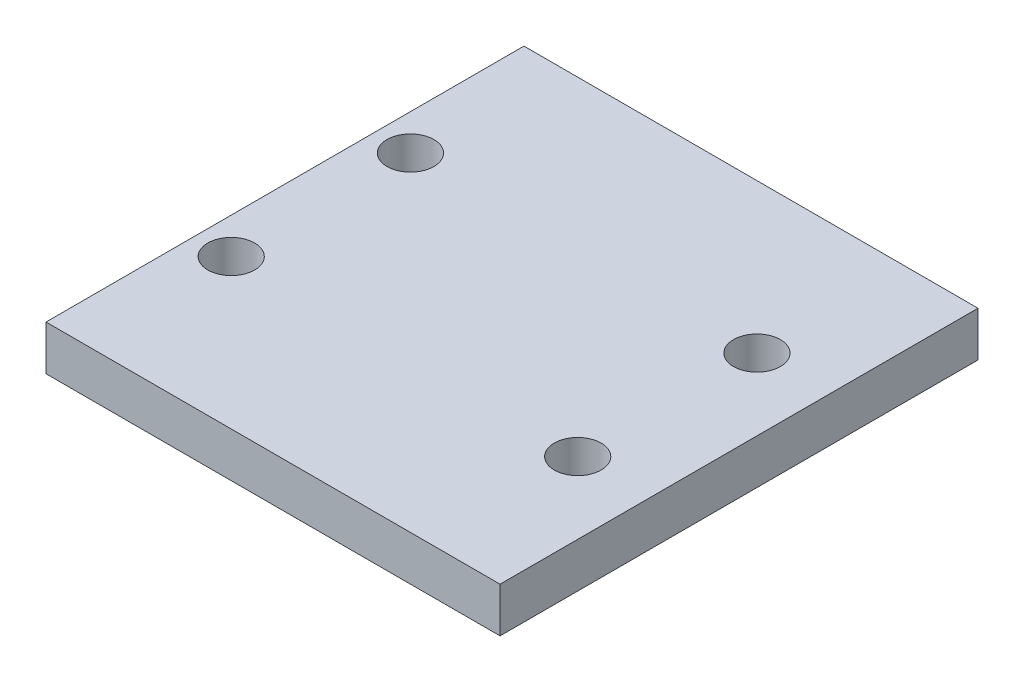
ISO-10303-21;
HEADER;
FILE_DESCRIPTION(('STEP AP214'),'2;1');
FILE_NAME('part.step','',(''),(''),'','','');
FILE_SCHEMA(('AUTOMOTIVE_DESIGN { 1 0 10303 214 1 1 1 1 }'));
ENDSEC;
DATA;
#1=APPLICATION_CONTEXT('core data for automotive mechanical design processes');
#2=APPLICATION_PROTOCOL_DEFINITION('international standard','automotive_design',2000,#1);
#3=PRODUCT_CONTEXT('',#1,'mechanical');
#4=PRODUCT('Part','Part','',(#3));
#5=PRODUCT_RELATED_PRODUCT_CATEGORY('part','',(#4));
#6=PRODUCT_DEFINITION_FORMATION('','',#4);
#7=PRODUCT_DEFINITION_CONTEXT('part definition',#1,'design');
#8=PRODUCT_DEFINITION('design','',#6,#7);
#9=PRODUCT_DEFINITION_SHAPE('','',#8);
#10=(LENGTH_UNIT() NAMED_UNIT(*) SI_UNIT(.MILLI.,.METRE.));
#11=(NAMED_UNIT(*) PLANE_ANGLE_UNIT() SI_UNIT($,.RADIAN.));
#12=(NAMED_UNIT(*) SI_UNIT($,.STERADIAN.) SOLID_ANGLE_UNIT());
#13=UNCERTAINTY_MEASURE_WITH_UNIT(LENGTH_MEASURE(1.E-05),#10,'distance_accuracy_value','');
#14=(GEOMETRIC_REPRESENTATION_CONTEXT(3) GLOBAL_UNCERTAINTY_ASSIGNED_CONTEXT((#13)) GLOBAL_UNIT_ASSIGNED_CONTEXT((#10,
#11,#12)) REPRESENTATION_CONTEXT('',''));
#15=CARTESIAN_POINT('',(0.,0.,0.));
#16=DIRECTION('',(0.,0.,1.));
#17=DIRECTION('',(1.,0.,0.));
#18=AXIS2_PLACEMENT_3D('',#15,#16,#17);
#19=CARTESIAN_POINT('',(0.,4.7625,0.));
#20=DIRECTION('',(1.,0.,0.));
#21=DIRECTION('',(0.,0.,-1.));
#22=AXIS2_PLACEMENT_3D('',#19,#20,#21);
#23=PLANE('',#22);
#24=DIRECTION('',(0.,0.,1.));
#25=VECTOR('',#24,1.);
#26=CARTESIAN_POINT('',(0.,0.,0.));
#27=LINE('',#26,#25);
#28=CARTESIAN_POINT('',(0.,0.,-50.8));
#29=VERTEX_POINT('',#28);
#30=CARTESIAN_POINT('',(0.,0.,0.));
#31=VERTEX_POINT('',#30);
#32=EDGE_CURVE('E107',#29,#31,#27,.T.);
#33=ORIENTED_EDGE('',*,*,#32,.T.);
#34=DIRECTION('',(0.,-1.,0.));
#35=VECTOR('',#34,1.);
#36=CARTESIAN_POINT('',(0.,4.7625,0.));
#37=LINE('',#36,#35);
#38=CARTESIAN_POINT('',(0.,4.7625,0.));
#39=VERTEX_POINT('',#38);
#40=EDGE_CURVE('E11',#39,#31,#37,.T.);
#41=ORIENTED_EDGE('',*,*,#40,.F.);
#42=DIRECTION('',(0.,0.,1.));
#43=VECTOR('',#42,1.);
#44=CARTESIAN_POINT('',(0.,4.7625,0.));
#45=LINE('',#44,#43);
#46=CARTESIAN_POINT('',(0.,4.7625,-50.8));
#47=VERTEX_POINT('',#46);
#48=EDGE_CURVE('E91',#47,#39,#45,.T.);
#49=ORIENTED_EDGE('',*,*,#48,.F.);
#50=DIRECTION('',(0.,-1.,0.));
#51=VECTOR('',#50,1.);
#52=CARTESIAN_POINT('',(0.,4.7625,-50.8));
#53=LINE('',#52,#51);
#54=EDGE_CURVE('E103',#47,#29,#53,.T.);
#55=ORIENTED_EDGE('',*,*,#54,.T.);
#56=EDGE_LOOP('',(#33,#41,#49,#55));
#57=FACE_BOUND('',#56,.T.);
#58=ADVANCED_FACE('F39',(#57),#23,.F.);
#59=CARTESIAN_POINT('',(0.,4.7625,0.));
#60=DIRECTION('',(0.,0.,-1.));
#61=DIRECTION('',(-1.,0.,0.));
#62=AXIS2_PLACEMENT_3D('',#59,#60,#61);
#63=PLANE('',#62);
#64=DIRECTION('',(1.,0.,0.));
#65=VECTOR('',#64,1.);
#66=CARTESIAN_POINT('',(0.,0.,0.));
#67=LINE('',#66,#65);
#68=CARTESIAN_POINT('',(48.26,0.,0.));
#69=VERTEX_POINT('',#68);
#70=EDGE_CURVE('E96',#31,#69,#67,.T.);
#71=ORIENTED_EDGE('',*,*,#70,.T.);
#72=DIRECTION('',(0.,-1.,0.));
#73=VECTOR('',#72,1.);
#74=CARTESIAN_POINT('',(48.26,4.7625,0.));
#75=LINE('',#74,#73);
#76=CARTESIAN_POINT('',(48.26,4.7625,0.));
#77=VERTEX_POINT('',#76);
#78=EDGE_CURVE('E48',#77,#69,#75,.T.);
#79=ORIENTED_EDGE('',*,*,#78,.F.);
#80=DIRECTION('',(1.,0.,0.));
#81=VECTOR('',#80,1.);
#82=CARTESIAN_POINT('',(0.,4.7625,0.));
#83=LINE('',#82,#81);
#84=EDGE_CURVE('E86',#39,#77,#83,.T.);
#85=ORIENTED_EDGE('',*,*,#84,.F.);
#86=ORIENTED_EDGE('',*,*,#40,.T.);
#87=EDGE_LOOP('',(#71,#79,#85,#86));
#88=FACE_BOUND('',#87,.T.);
#89=ADVANCED_FACE('F95',(#88),#63,.F.);
#90=CARTESIAN_POINT('',(48.26,4.7625,0.));
#91=DIRECTION('',(-1.,0.,0.));
#92=DIRECTION('',(0.,0.,1.));
#93=AXIS2_PLACEMENT_3D('',#90,#91,#92);
#94=PLANE('',#93);
#95=DIRECTION('',(0.,0.,-1.));
#96=VECTOR('',#95,1.);
#97=CARTESIAN_POINT('',(48.26,0.,0.));
#98=LINE('',#97,#96);
#99=CARTESIAN_POINT('',(48.26,0.,-50.8));
#100=VERTEX_POINT('',#99);
#101=EDGE_CURVE('E73',#69,#100,#98,.T.);
#102=ORIENTED_EDGE('',*,*,#101,.T.);
#103=DIRECTION('',(0.,-1.,0.));
#104=VECTOR('',#103,1.);
#105=CARTESIAN_POINT('',(48.26,4.7625,-50.8));
#106=LINE('',#105,#104);
#107=CARTESIAN_POINT('',(48.26,4.7625,-50.8));
#108=VERTEX_POINT('',#107);
#109=EDGE_CURVE('E98',#108,#100,#106,.T.);
#110=ORIENTED_EDGE('',*,*,#109,.F.);
#111=DIRECTION('',(0.,0.,-1.));
#112=VECTOR('',#111,1.);
#113=CARTESIAN_POINT('',(48.26,4.7625,0.));
#114=LINE('',#113,#112);
#115=EDGE_CURVE('E89',#77,#108,#114,.T.);
#116=ORIENTED_EDGE('',*,*,#115,.F.);
#117=ORIENTED_EDGE('',*,*,#78,.T.);
#118=EDGE_LOOP('',(#102,#110,#116,#117));
#119=FACE_BOUND('',#118,.T.);
#120=ADVANCED_FACE('F99',(#119),#94,.F.);
#121=CARTESIAN_POINT('',(0.,4.7625,-50.8));
#122=DIRECTION('',(0.,0.,1.));
#123=DIRECTION('',(1.,0.,0.));
#124=AXIS2_PLACEMENT_3D('',#121,#122,#123);
#125=PLANE('',#124);
#126=DIRECTION('',(-1.,0.,0.));
#127=VECTOR('',#126,1.);
#128=CARTESIAN_POINT('',(0.,0.,-50.8));
#129=LINE('',#128,#127);
#130=EDGE_CURVE('E79',#100,#29,#129,.T.);
#131=ORIENTED_EDGE('',*,*,#130,.T.);
#132=ORIENTED_EDGE('',*,*,#54,.F.);
#133=DIRECTION('',(-1.,0.,0.));
#134=VECTOR('',#133,1.);
#135=CARTESIAN_POINT('',(0.,4.7625,-50.8));
#136=LINE('',#135,#134);
#137=EDGE_CURVE('E56',#108,#47,#136,.T.);
#138=ORIENTED_EDGE('',*,*,#137,.F.);
#139=ORIENTED_EDGE('',*,*,#109,.T.);
#140=EDGE_LOOP('',(#131,#132,#138,#139));
#141=FACE_BOUND('',#140,.T.);
#142=ADVANCED_FACE('F121',(#141),#125,.F.);
#143=CARTESIAN_POINT('',(0.,4.7625,0.));
#144=DIRECTION('',(0.,-1.,0.));
#145=DIRECTION('',(0.,0.,-1.));
#146=AXIS2_PLACEMENT_3D('',#143,#144,#145);
#147=PLANE('',#146);
#148=CARTESIAN_POINT('',(3.81,4.7625,-34.925));
#149=DIRECTION('',(0.,1.,0.));
#150=DIRECTION('',(0.,0.,-1.));
#151=AXIS2_PLACEMENT_3D('',#148,#149,#150);
#152=CIRCLE('',#151,2.4892);
#153=CARTESIAN_POINT('',(3.81,4.7625,-32.4358));
#154=VERTEX_POINT('',#153);
#155=EDGE_CURVE('E136',#154,#154,#152,.T.);
#156=ORIENTED_EDGE('',*,*,#155,.F.);
#157=EDGE_LOOP('',(#156));
#158=FACE_BOUND('',#157,.T.);
#159=CARTESIAN_POINT('',(40.64,4.7625,-34.925));
#160=DIRECTION('',(0.,1.,0.));
#161=DIRECTION('',(0.,0.,1.));
#162=AXIS2_PLACEMENT_3D('',#159,#160,#161);
#163=CIRCLE('',#162,2.4892);
#164=CARTESIAN_POINT('',(40.64,4.7625,-32.4358));
#165=VERTEX_POINT('',#164);
#166=EDGE_CURVE('E144',#165,#165,#163,.T.);
#167=ORIENTED_EDGE('',*,*,#166,.F.);
#168=EDGE_LOOP('',(#167));
#169=FACE_BOUND('',#168,.T.);
#170=CARTESIAN_POINT('',(40.64,4.7625,-15.875));
#171=DIRECTION('',(0.,1.,0.));
#172=DIRECTION('',(0.,0.,-1.));
#173=AXIS2_PLACEMENT_3D('',#170,#171,#172);
#174=CIRCLE('',#173,2.4892);
#175=CARTESIAN_POINT('',(40.64,4.7625,-13.3858));
#176=VERTEX_POINT('',#175);
#177=EDGE_CURVE('E152',#176,#176,#174,.T.);
#178=ORIENTED_EDGE('',*,*,#177,.F.);
#179=EDGE_LOOP('',(#178));
#180=FACE_BOUND('',#179,.T.);
#181=CARTESIAN_POINT('',(3.81,4.7625,-15.875));
#182=DIRECTION('',(0.,1.,0.));
#183=DIRECTION('',(0.,0.,1.));
#184=AXIS2_PLACEMENT_3D('',#181,#182,#183);
#185=CIRCLE('',#184,2.4892);
#186=CARTESIAN_POINT('',(3.81,4.7625,-13.3858));
#187=VERTEX_POINT('',#186);
#188=EDGE_CURVE('E128',#187,#187,#185,.T.);
#189=ORIENTED_EDGE('',*,*,#188,.F.);
#190=EDGE_LOOP('',(#189));
#191=FACE_BOUND('',#190,.T.);
#192=ORIENTED_EDGE('',*,*,#48,.T.);
#193=ORIENTED_EDGE('',*,*,#84,.T.);
#194=ORIENTED_EDGE('',*,*,#115,.T.);
#195=ORIENTED_EDGE('',*,*,#137,.T.);
#196=EDGE_LOOP('',(#192,#193,#194,#195));
#197=FACE_BOUND('',#196,.T.);
#198=ADVANCED_FACE('F87',(#158,#169,#180,#191,#197),#147,.F.);
#199=CARTESIAN_POINT('',(0.,0.,0.));
#200=DIRECTION('',(0.,-1.,0.));
#201=DIRECTION('',(0.,0.,-1.));
#202=AXIS2_PLACEMENT_3D('',#199,#200,#201);
#203=PLANE('',#202);
#204=CARTESIAN_POINT('',(3.81,0.,-34.925));
#205=DIRECTION('',(0.,1.,0.));
#206=DIRECTION('',(0.,0.,-1.));
#207=AXIS2_PLACEMENT_3D('',#204,#205,#206);
#208=CIRCLE('',#207,2.4892);
#209=CARTESIAN_POINT('',(3.81,0.,-32.4358));
#210=VERTEX_POINT('',#209);
#211=EDGE_CURVE('E140',#210,#210,#208,.T.);
#212=ORIENTED_EDGE('',*,*,#211,.T.);
#213=EDGE_LOOP('',(#212));
#214=FACE_BOUND('',#213,.T.);
#215=CARTESIAN_POINT('',(40.64,0.,-34.925));
#216=DIRECTION('',(0.,1.,0.));
#217=DIRECTION('',(0.,0.,1.));
#218=AXIS2_PLACEMENT_3D('',#215,#216,#217);
#219=CIRCLE('',#218,2.4892);
#220=CARTESIAN_POINT('',(40.64,0.,-32.4358));
#221=VERTEX_POINT('',#220);
#222=EDGE_CURVE('E148',#221,#221,#219,.T.);
#223=ORIENTED_EDGE('',*,*,#222,.T.);
#224=EDGE_LOOP('',(#223));
#225=FACE_BOUND('',#224,.T.);
#226=CARTESIAN_POINT('',(40.64,0.,-15.875));
#227=DIRECTION('',(0.,1.,0.));
#228=DIRECTION('',(0.,0.,-1.));
#229=AXIS2_PLACEMENT_3D('',#226,#227,#228);
#230=CIRCLE('',#229,2.4892);
#231=CARTESIAN_POINT('',(40.64,0.,-13.3858));
#232=VERTEX_POINT('',#231);
#233=EDGE_CURVE('E132',#232,#232,#230,.T.);
#234=ORIENTED_EDGE('',*,*,#233,.T.);
#235=EDGE_LOOP('',(#234));
#236=FACE_BOUND('',#235,.T.);
#237=CARTESIAN_POINT('',(3.81,0.,-15.875));
#238=DIRECTION('',(0.,1.,0.));
#239=DIRECTION('',(0.,0.,1.));
#240=AXIS2_PLACEMENT_3D('',#237,#238,#239);
#241=CIRCLE('',#240,2.4892);
#242=CARTESIAN_POINT('',(3.81,0.,-13.3858));
#243=VERTEX_POINT('',#242);
#244=EDGE_CURVE('E111',#243,#243,#241,.T.);
#245=ORIENTED_EDGE('',*,*,#244,.T.);
#246=EDGE_LOOP('',(#245));
#247=FACE_BOUND('',#246,.T.);
#248=ORIENTED_EDGE('',*,*,#32,.F.);
#249=ORIENTED_EDGE('',*,*,#130,.F.);
#250=ORIENTED_EDGE('',*,*,#101,.F.);
#251=ORIENTED_EDGE('',*,*,#70,.F.);
#252=EDGE_LOOP('',(#248,#249,#250,#251));
#253=FACE_BOUND('',#252,.T.);
#254=ADVANCED_FACE('F124',(#214,#225,#236,#247,#253),#203,.T.);
#255=CARTESIAN_POINT('',(3.81,0.,-15.875));
#256=DIRECTION('',(0.,1.,0.));
#257=DIRECTION('',(0.,0.,1.));
#258=AXIS2_PLACEMENT_3D('',#255,#256,#257);
#259=CYLINDRICAL_SURFACE('',#258,2.4892);
#260=CARTESIAN_POINT('',(3.81,0.,-13.3858));
#261=CARTESIAN_POINT('',(3.81,0.049609375,-13.3858));
#262=CARTESIAN_POINT('',(3.81,0.09921875,-13.3858));
#263=CARTESIAN_POINT('',(3.81,0.1984375,-13.3858));
#264=CARTESIAN_POINT('',(3.81,0.248046875,-13.3858));
#265=CARTESIAN_POINT('',(3.81,0.347265625,-13.3858));
#266=CARTESIAN_POINT('',(3.81,0.396875,-13.3858));
#267=CARTESIAN_POINT('',(3.81,0.49609375,-13.3858));
#268=CARTESIAN_POINT('',(3.81,0.545703125,-13.3858));
#269=CARTESIAN_POINT('',(3.81,0.644921875,-13.3858));
#270=CARTESIAN_POINT('',(3.81,0.69453125,-13.3858));
#271=CARTESIAN_POINT('',(3.81,0.79375,-13.3858));
#272=CARTESIAN_POINT('',(3.81,0.843359375,-13.3858));
#273=CARTESIAN_POINT('',(3.81,0.942578125,-13.3858));
#274=CARTESIAN_POINT('',(3.81,0.9921875,-13.3858));
#275=CARTESIAN_POINT('',(3.81,1.09140625,-13.3858));
#276=CARTESIAN_POINT('',(3.81,1.141015625,-13.3858));
#277=CARTESIAN_POINT('',(3.81,1.240234375,-13.3858));
#278=CARTESIAN_POINT('',(3.81,1.28984375,-13.3858));
#279=CARTESIAN_POINT('',(3.81,1.3890625,-13.3858));
#280=CARTESIAN_POINT('',(3.81,1.438671875,-13.3858));
#281=CARTESIAN_POINT('',(3.81,1.537890625,-13.3858));
#282=CARTESIAN_POINT('',(3.81,1.5875,-13.3858));
#283=CARTESIAN_POINT('',(3.81,1.68671875,-13.3858));
#284=CARTESIAN_POINT('',(3.81,1.736328125,-13.3858));
#285=CARTESIAN_POINT('',(3.81,1.835546875,-13.3858));
#286=CARTESIAN_POINT('',(3.81,1.88515625,-13.3858));
#287=CARTESIAN_POINT('',(3.81,1.984375,-13.3858));
#288=CARTESIAN_POINT('',(3.81,2.033984375,-13.3858));
#289=CARTESIAN_POINT('',(3.81,2.133203125,-13.3858));
#290=CARTESIAN_POINT('',(3.81,2.1828125,-13.3858));
#291=CARTESIAN_POINT('',(3.81,2.28203125,-13.3858));
#292=CARTESIAN_POINT('',(3.81,2.331640625,-13.3858));
#293=CARTESIAN_POINT('',(3.81,2.430859375,-13.3858));
#294=CARTESIAN_POINT('',(3.81,2.48046875,-13.3858));
#295=CARTESIAN_POINT('',(3.81,2.5796875,-13.3858));
#296=CARTESIAN_POINT('',(3.81,2.629296875,-13.3858));
#297=CARTESIAN_POINT('',(3.81,2.728515625,-13.3858));
#298=CARTESIAN_POINT('',(3.81,2.778125,-13.3858));
#299=CARTESIAN_POINT('',(3.81,2.87734375,-13.3858));
#300=CARTESIAN_POINT('',(3.81,2.926953125,-13.3858));
#301=CARTESIAN_POINT('',(3.81,3.026171875,-13.3858));
#302=CARTESIAN_POINT('',(3.81,3.07578125,-13.3858));
#303=CARTESIAN_POINT('',(3.81,3.175,-13.3858));
#304=CARTESIAN_POINT('',(3.81,3.224609375,-13.3858));
#305=CARTESIAN_POINT('',(3.81,3.323828125,-13.3858));
#306=CARTESIAN_POINT('',(3.81,3.3734375,-13.3858));
#307=CARTESIAN_POINT('',(3.81,3.47265625,-13.3858));
#308=CARTESIAN_POINT('',(3.81,3.522265625,-13.3858));
#309=CARTESIAN_POINT('',(3.81,3.621484375,-13.3858));
#310=CARTESIAN_POINT('',(3.81,3.67109375,-13.3858));
#311=CARTESIAN_POINT('',(3.81,3.7703125,-13.3858));
#312=CARTESIAN_POINT('',(3.81,3.819921875,-13.3858));
#313=CARTESIAN_POINT('',(3.81,3.919140625,-13.3858));
#314=CARTESIAN_POINT('',(3.81,3.96875,-13.3858));
#315=CARTESIAN_POINT('',(3.81,4.06796875,-13.3858));
#316=CARTESIAN_POINT('',(3.81,4.117578125,-13.3858));
#317=CARTESIAN_POINT('',(3.81,4.216796875,-13.3858));
#318=CARTESIAN_POINT('',(3.81,4.26640625,-13.3858));
#319=CARTESIAN_POINT('',(3.81,4.365625,-13.3858));
#320=CARTESIAN_POINT('',(3.81,4.415234375,-13.3858));
#321=CARTESIAN_POINT('',(3.81,4.514453125,-13.3858));
#322=CARTESIAN_POINT('',(3.81,4.5640625,-13.3858));
#323=CARTESIAN_POINT('',(3.81,4.66328125,-13.3858));
#324=CARTESIAN_POINT('',(3.81,4.712890625,-13.3858));
#325=CARTESIAN_POINT('',(3.81,4.7625,-13.3858));
#326=B_SPLINE_CURVE_WITH_KNOTS('',3,(#260,#261,#262,#263,#264,#265,#266,#267,#268,#269,#270,
#271,#272,#273,#274,#275,#276,#277,#278,#279,#280,#281,#282,#283,#284,#285,#286,#287,#288,#289,
#290,#291,#292,#293,#294,#295,#296,#297,#298,#299,#300,#301,#302,#303,#304,#305,#306,#307,#308,
#309,#310,#311,#312,#313,#314,#315,#316,#317,#318,#319,#320,#321,#322,#323,#324,#325),
.UNSPECIFIED.,.F.,.F.,(4,2,2,2,2,2,2,2,2,2,2,2,2,2,2,2,2,2,2,2,2,2,2,2,2,2,2,2,2,2,2,2,4),(0.,
0.148828125,0.29765625,0.446484375,0.5953125,0.744140625,0.89296875,1.041796875,1.190625,
1.339453125,1.48828125,1.637109375,1.7859375,1.934765625,2.08359375,2.232421875,2.38125,
2.530078125,2.67890625,2.827734375,2.9765625,3.125390625,3.27421875,3.423046875,3.571875,
3.720703125,3.86953125,4.018359375,4.1671875,4.316015625,4.46484375,4.613671875,4.7625),.UNSPECIFIED.);
#327=EDGE_CURVE('BSEAM166',#243,#187,#326,.T.);
#328=ORIENTED_EDGE('',*,*,#244,.F.);
#329=ORIENTED_EDGE('',*,*,#188,.T.);
#330=ORIENTED_EDGE('',*,*,#327,.T.);
#331=ORIENTED_EDGE('',*,*,#327,.F.);
#332=EDGE_LOOP('',(#328,#330,#329,#331));
#333=FACE_BOUND('',#332,.T.);
#334=ADVANCED_FACE('F166',(#333),#259,.F.);
#335=CARTESIAN_POINT('',(40.64,0.,-15.875));
#336=DIRECTION('',(0.,1.,0.));
#337=DIRECTION('',(0.,0.,1.));
#338=AXIS2_PLACEMENT_3D('',#335,#336,#337);
#339=CYLINDRICAL_SURFACE('',#338,2.4892);
#340=CARTESIAN_POINT('',(40.64,0.,-13.3858));
#341=CARTESIAN_POINT('',(40.64,0.049609375,-13.3858));
#342=CARTESIAN_POINT('',(40.64,0.09921875,-13.3858));
#343=CARTESIAN_POINT('',(40.64,0.1984375,-13.3858));
#344=CARTESIAN_POINT('',(40.64,0.248046875,-13.3858));
#345=CARTESIAN_POINT('',(40.64,0.347265625,-13.3858));
#346=CARTESIAN_POINT('',(40.64,0.396875,-13.3858));
#347=CARTESIAN_POINT('',(40.64,0.49609375,-13.3858));
#348=CARTESIAN_POINT('',(40.64,0.545703125,-13.3858));
#349=CARTESIAN_POINT('',(40.64,0.644921875,-13.3858));
#350=CARTESIAN_POINT('',(40.64,0.69453125,-13.3858));
#351=CARTESIAN_POINT('',(40.64,0.79375,-13.3858));
#352=CARTESIAN_POINT('',(40.64,0.843359375,-13.3858));
#353=CARTESIAN_POINT('',(40.64,0.942578125,-13.3858));
#354=CARTESIAN_POINT('',(40.64,0.9921875,-13.3858));
#355=CARTESIAN_POINT('',(40.64,1.09140625,-13.3858));
#356=CARTESIAN_POINT('',(40.64,1.141015625,-13.3858));
#357=CARTESIAN_POINT('',(40.64,1.240234375,-13.3858));
#358=CARTESIAN_POINT('',(40.64,1.28984375,-13.3858));
#359=CARTESIAN_POINT('',(40.64,1.3890625,-13.3858));
#360=CARTESIAN_POINT('',(40.64,1.438671875,-13.3858));
#361=CARTESIAN_POINT('',(40.64,1.537890625,-13.3858));
#362=CARTESIAN_POINT('',(40.64,1.5875,-13.3858));
#363=CARTESIAN_POINT('',(40.64,1.68671875,-13.3858));
#364=CARTESIAN_POINT('',(40.64,1.736328125,-13.3858));
#365=CARTESIAN_POINT('',(40.64,1.835546875,-13.3858));
#366=CARTESIAN_POINT('',(40.64,1.88515625,-13.3858));
#367=CARTESIAN_POINT('',(40.64,1.984375,-13.3858));
#368=CARTESIAN_POINT('',(40.64,2.033984375,-13.3858));
#369=CARTESIAN_POINT('',(40.64,2.133203125,-13.3858));
#370=CARTESIAN_POINT('',(40.64,2.1828125,-13.3858));
#371=CARTESIAN_POINT('',(40.64,2.28203125,-13.3858));
#372=CARTESIAN_POINT('',(40.64,2.331640625,-13.3858));
#373=CARTESIAN_POINT('',(40.64,2.430859375,-13.3858));
#374=CARTESIAN_POINT('',(40.64,2.48046875,-13.3858));
#375=CARTESIAN_POINT('',(40.64,2.5796875,-13.3858));
#376=CARTESIAN_POINT('',(40.64,2.629296875,-13.3858));
#377=CARTESIAN_POINT('',(40.64,2.728515625,-13.3858));
#378=CARTESIAN_POINT('',(40.64,2.778125,-13.3858));
#379=CARTESIAN_POINT('',(40.64,2.87734375,-13.3858));
#380=CARTESIAN_POINT('',(40.64,2.926953125,-13.3858));
#381=CARTESIAN_POINT('',(40.64,3.026171875,-13.3858));
#382=CARTESIAN_POINT('',(40.64,3.07578125,-13.3858));
#383=CARTESIAN_POINT('',(40.64,3.175,-13.3858));
#384=CARTESIAN_POINT('',(40.64,3.224609375,-13.3858));
#385=CARTESIAN_POINT('',(40.64,3.323828125,-13.3858));
#386=CARTESIAN_POINT('',(40.64,3.3734375,-13.3858));
#387=CARTESIAN_POINT('',(40.64,3.47265625,-13.3858));
#388=CARTESIAN_POINT('',(40.64,3.522265625,-13.3858));
#389=CARTESIAN_POINT('',(40.64,3.621484375,-13.3858));
#390=CARTESIAN_POINT('',(40.64,3.67109375,-13.3858));
#391=CARTESIAN_POINT('',(40.64,3.7703125,-13.3858));
#392=CARTESIAN_POINT('',(40.64,3.819921875,-13.3858));
#393=CARTESIAN_POINT('',(40.64,3.919140625,-13.3858));
#394=CARTESIAN_POINT('',(40.64,3.96875,-13.3858));
#395=CARTESIAN_POINT('',(40.64,4.06796875,-13.3858));
#396=CARTESIAN_POINT('',(40.64,4.117578125,-13.3858));
#397=CARTESIAN_POINT('',(40.64,4.216796875,-13.3858));
#398=CARTESIAN_POINT('',(40.64,4.26640625,-13.3858));
#399=CARTESIAN_POINT('',(40.64,4.365625,-13.3858));
#400=CARTESIAN_POINT('',(40.64,4.415234375,-13.3858));
#401=CARTESIAN_POINT('',(40.64,4.514453125,-13.3858));
#402=CARTESIAN_POINT('',(40.64,4.5640625,-13.3858));
#403=CARTESIAN_POINT('',(40.64,4.66328125,-13.3858));
#404=CARTESIAN_POINT('',(40.64,4.712890625,-13.3858));
#405=CARTESIAN_POINT('',(40.64,4.7625,-13.3858));
#406=B_SPLINE_CURVE_WITH_KNOTS('',3,(#340,#341,#342,#343,#344,#345,#346,#347,#348,#349,#350,
#351,#352,#353,#354,#355,#356,#357,#358,#359,#360,#361,#362,#363,#364,#365,#366,#367,#368,#369,
#370,#371,#372,#373,#374,#375,#376,#377,#378,#379,#380,#381,#382,#383,#384,#385,#386,#387,#388,
#389,#390,#391,#392,#393,#394,#395,#396,#397,#398,#399,#400,#401,#402,#403,#404,#405),
.UNSPECIFIED.,.F.,.F.,(4,2,2,2,2,2,2,2,2,2,2,2,2,2,2,2,2,2,2,2,2,2,2,2,2,2,2,2,2,2,2,2,4),(0.,
0.148828125,0.29765625,0.446484375,0.5953125,0.744140625,0.89296875,1.041796875,1.190625,
1.339453125,1.48828125,1.637109375,1.7859375,1.934765625,2.08359375,2.232421875,2.38125,
2.530078125,2.67890625,2.827734375,2.9765625,3.125390625,3.27421875,3.423046875,3.571875,
3.720703125,3.86953125,4.018359375,4.1671875,4.316015625,4.46484375,4.613671875,4.7625),.UNSPECIFIED.);
#407=EDGE_CURVE('BSEAM162',#232,#176,#406,.T.);
#408=ORIENTED_EDGE('',*,*,#233,.F.);
#409=ORIENTED_EDGE('',*,*,#177,.T.);
#410=ORIENTED_EDGE('',*,*,#407,.T.);
#411=ORIENTED_EDGE('',*,*,#407,.F.);
#412=EDGE_LOOP('',(#408,#410,#409,#411));
#413=FACE_BOUND('',#412,.T.);
#414=ADVANCED_FACE('F162',(#413),#339,.F.);
#415=CARTESIAN_POINT('',(40.64,0.,-34.925));
#416=DIRECTION('',(0.,1.,0.));
#417=DIRECTION('',(0.,0.,1.));
#418=AXIS2_PLACEMENT_3D('',#415,#416,#417);
#419=CYLINDRICAL_SURFACE('',#418,2.4892);
#420=CARTESIAN_POINT('',(40.64,0.,-32.4358));
#421=CARTESIAN_POINT('',(40.64,0.049609375,-32.4358));
#422=CARTESIAN_POINT('',(40.64,0.09921875,-32.4358));
#423=CARTESIAN_POINT('',(40.64,0.1984375,-32.4358));
#424=CARTESIAN_POINT('',(40.64,0.248046875,-32.4358));
#425=CARTESIAN_POINT('',(40.64,0.347265625,-32.4358));
#426=CARTESIAN_POINT('',(40.64,0.396875,-32.4358));
#427=CARTESIAN_POINT('',(40.64,0.49609375,-32.4358));
#428=CARTESIAN_POINT('',(40.64,0.545703125,-32.4358));
#429=CARTESIAN_POINT('',(40.64,0.644921875,-32.4358));
#430=CARTESIAN_POINT('',(40.64,0.69453125,-32.4358));
#431=CARTESIAN_POINT('',(40.64,0.79375,-32.4358));
#432=CARTESIAN_POINT('',(40.64,0.843359375,-32.4358));
#433=CARTESIAN_POINT('',(40.64,0.942578125,-32.4358));
#434=CARTESIAN_POINT('',(40.64,0.9921875,-32.4358));
#435=CARTESIAN_POINT('',(40.64,1.09140625,-32.4358));
#436=CARTESIAN_POINT('',(40.64,1.141015625,-32.4358));
#437=CARTESIAN_POINT('',(40.64,1.240234375,-32.4358));
#438=CARTESIAN_POINT('',(40.64,1.28984375,-32.4358));
#439=CARTESIAN_POINT('',(40.64,1.3890625,-32.4358));
#440=CARTESIAN_POINT('',(40.64,1.438671875,-32.4358));
#441=CARTESIAN_POINT('',(40.64,1.537890625,-32.4358));
#442=CARTESIAN_POINT('',(40.64,1.5875,-32.4358));
#443=CARTESIAN_POINT('',(40.64,1.68671875,-32.4358));
#444=CARTESIAN_POINT('',(40.64,1.736328125,-32.4358));
#445=CARTESIAN_POINT('',(40.64,1.835546875,-32.4358));
#446=CARTESIAN_POINT('',(40.64,1.88515625,-32.4358));
#447=CARTESIAN_POINT('',(40.64,1.984375,-32.4358));
#448=CARTESIAN_POINT('',(40.64,2.033984375,-32.4358));
#449=CARTESIAN_POINT('',(40.64,2.133203125,-32.4358));
#450=CARTESIAN_POINT('',(40.64,2.1828125,-32.4358));
#451=CARTESIAN_POINT('',(40.64,2.28203125,-32.4358));
#452=CARTESIAN_POINT('',(40.64,2.331640625,-32.4358));
#453=CARTESIAN_POINT('',(40.64,2.430859375,-32.4358));
#454=CARTESIAN_POINT('',(40.64,2.48046875,-32.4358));
#455=CARTESIAN_POINT('',(40.64,2.5796875,-32.4358));
#456=CARTESIAN_POINT('',(40.64,2.629296875,-32.4358));
#457=CARTESIAN_POINT('',(40.64,2.728515625,-32.4358));
#458=CARTESIAN_POINT('',(40.64,2.778125,-32.4358));
#459=CARTESIAN_POINT('',(40.64,2.87734375,-32.4358));
#460=CARTESIAN_POINT('',(40.64,2.926953125,-32.4358));
#461=CARTESIAN_POINT('',(40.64,3.026171875,-32.4358));
#462=CARTESIAN_POINT('',(40.64,3.07578125,-32.4358));
#463=CARTESIAN_POINT('',(40.64,3.175,-32.4358));
#464=CARTESIAN_POINT('',(40.64,3.224609375,-32.4358));
#465=CARTESIAN_POINT('',(40.64,3.323828125,-32.4358));
#466=CARTESIAN_POINT('',(40.64,3.3734375,-32.4358));
#467=CARTESIAN_POINT('',(40.64,3.47265625,-32.4358));
#468=CARTESIAN_POINT('',(40.64,3.522265625,-32.4358));
#469=CARTESIAN_POINT('',(40.64,3.621484375,-32.4358));
#470=CARTESIAN_POINT('',(40.64,3.67109375,-32.4358));
#471=CARTESIAN_POINT('',(40.64,3.7703125,-32.4358));
#472=CARTESIAN_POINT('',(40.64,3.819921875,-32.4358));
#473=CARTESIAN_POINT('',(40.64,3.919140625,-32.4358));
#474=CARTESIAN_POINT('',(40.64,3.96875,-32.4358));
#475=CARTESIAN_POINT('',(40.64,4.06796875,-32.4358));
#476=CARTESIAN_POINT('',(40.64,4.117578125,-32.4358));
#477=CARTESIAN_POINT('',(40.64,4.216796875,-32.4358));
#478=CARTESIAN_POINT('',(40.64,4.26640625,-32.4358));
#479=CARTESIAN_POINT('',(40.64,4.365625,-32.4358));
#480=CARTESIAN_POINT('',(40.64,4.415234375,-32.4358));
#481=CARTESIAN_POINT('',(40.64,4.514453125,-32.4358));
#482=CARTESIAN_POINT('',(40.64,4.5640625,-32.4358));
#483=CARTESIAN_POINT('',(40.64,4.66328125,-32.4358));
#484=CARTESIAN_POINT('',(40.64,4.712890625,-32.4358));
#485=CARTESIAN_POINT('',(40.64,4.7625,-32.4358));
#486=B_SPLINE_CURVE_WITH_KNOTS('',3,(#420,#421,#422,#423,#424,#425,#426,#427,#428,#429,#430,
#431,#432,#433,#434,#435,#436,#437,#438,#439,#440,#441,#442,#443,#444,#445,#446,#447,#448,#449,
#450,#451,#452,#453,#454,#455,#456,#457,#458,#459,#460,#461,#462,#463,#464,#465,#466,#467,#468,
#469,#470,#471,#472,#473,#474,#475,#476,#477,#478,#479,#480,#481,#482,#483,#484,#485),
.UNSPECIFIED.,.F.,.F.,(4,2,2,2,2,2,2,2,2,2,2,2,2,2,2,2,2,2,2,2,2,2,2,2,2,2,2,2,2,2,2,2,4),(0.,
0.148828125,0.29765625,0.446484375,0.5953125,0.744140625,0.89296875,1.041796875,1.190625,
1.339453125,1.48828125,1.637109375,1.7859375,1.934765625,2.08359375,2.232421875,2.38125,
2.530078125,2.67890625,2.827734375,2.9765625,3.125390625,3.27421875,3.423046875,3.571875,
3.720703125,3.86953125,4.018359375,4.1671875,4.316015625,4.46484375,4.613671875,4.7625),.UNSPECIFIED.);
#487=EDGE_CURVE('BSEAM165',#221,#165,#486,.T.);
#488=ORIENTED_EDGE('',*,*,#222,.F.);
#489=ORIENTED_EDGE('',*,*,#166,.T.);
#490=ORIENTED_EDGE('',*,*,#487,.T.);
#491=ORIENTED_EDGE('',*,*,#487,.F.);
#492=EDGE_LOOP('',(#488,#490,#489,#491));
#493=FACE_BOUND('',#492,.T.);
#494=ADVANCED_FACE('F165',(#493),#419,.F.);
#495=CARTESIAN_POINT('',(3.81,0.,-34.925));
#496=DIRECTION('',(0.,1.,0.));
#497=DIRECTION('',(0.,0.,1.));
#498=AXIS2_PLACEMENT_3D('',#495,#496,#497);
#499=CYLINDRICAL_SURFACE('',#498,2.4892);
#500=CARTESIAN_POINT('',(3.81,0.,-32.4358));
#501=CARTESIAN_POINT('',(3.81,0.049609375,-32.4358));
#502=CARTESIAN_POINT('',(3.81,0.09921875,-32.4358));
#503=CARTESIAN_POINT('',(3.81,0.1984375,-32.4358));
#504=CARTESIAN_POINT('',(3.81,0.248046875,-32.4358));
#505=CARTESIAN_POINT('',(3.81,0.347265625,-32.4358));
#506=CARTESIAN_POINT('',(3.81,0.396875,-32.4358));
#507=CARTESIAN_POINT('',(3.81,0.49609375,-32.4358));
#508=CARTESIAN_POINT('',(3.81,0.545703125,-32.4358));
#509=CARTESIAN_POINT('',(3.81,0.644921875,-32.4358));
#510=CARTESIAN_POINT('',(3.81,0.69453125,-32.4358));
#511=CARTESIAN_POINT('',(3.81,0.79375,-32.4358));
#512=CARTESIAN_POINT('',(3.81,0.843359375,-32.4358));
#513=CARTESIAN_POINT('',(3.81,0.942578125,-32.4358));
#514=CARTESIAN_POINT('',(3.81,0.9921875,-32.4358));
#515=CARTESIAN_POINT('',(3.81,1.09140625,-32.4358));
#516=CARTESIAN_POINT('',(3.81,1.141015625,-32.4358));
#517=CARTESIAN_POINT('',(3.81,1.240234375,-32.4358));
#518=CARTESIAN_POINT('',(3.81,1.28984375,-32.4358));
#519=CARTESIAN_POINT('',(3.81,1.3890625,-32.4358));
#520=CARTESIAN_POINT('',(3.81,1.438671875,-32.4358));
#521=CARTESIAN_POINT('',(3.81,1.537890625,-32.4358));
#522=CARTESIAN_POINT('',(3.81,1.5875,-32.4358));
#523=CARTESIAN_POINT('',(3.81,1.68671875,-32.4358));
#524=CARTESIAN_POINT('',(3.81,1.736328125,-32.4358));
#525=CARTESIAN_POINT('',(3.81,1.835546875,-32.4358));
#526=CARTESIAN_POINT('',(3.81,1.88515625,-32.4358));
#527=CARTESIAN_POINT('',(3.81,1.984375,-32.4358));
#528=CARTESIAN_POINT('',(3.81,2.033984375,-32.4358));
#529=CARTESIAN_POINT('',(3.81,2.133203125,-32.4358));
#530=CARTESIAN_POINT('',(3.81,2.1828125,-32.4358));
#531=CARTESIAN_POINT('',(3.81,2.28203125,-32.4358));
#532=CARTESIAN_POINT('',(3.81,2.331640625,-32.4358));
#533=CARTESIAN_POINT('',(3.81,2.430859375,-32.4358));
#534=CARTESIAN_POINT('',(3.81,2.48046875,-32.4358));
#535=CARTESIAN_POINT('',(3.81,2.5796875,-32.4358));
#536=CARTESIAN_POINT('',(3.81,2.629296875,-32.4358));
#537=CARTESIAN_POINT('',(3.81,2.728515625,-32.4358));
#538=CARTESIAN_POINT('',(3.81,2.778125,-32.4358));
#539=CARTESIAN_POINT('',(3.81,2.87734375,-32.4358));
#540=CARTESIAN_POINT('',(3.81,2.926953125,-32.4358));
#541=CARTESIAN_POINT('',(3.81,3.026171875,-32.4358));
#542=CARTESIAN_POINT('',(3.81,3.07578125,-32.4358));
#543=CARTESIAN_POINT('',(3.81,3.175,-32.4358));
#544=CARTESIAN_POINT('',(3.81,3.224609375,-32.4358));
#545=CARTESIAN_POINT('',(3.81,3.323828125,-32.4358));
#546=CARTESIAN_POINT('',(3.81,3.3734375,-32.4358));
#547=CARTESIAN_POINT('',(3.81,3.47265625,-32.4358));
#548=CARTESIAN_POINT('',(3.81,3.522265625,-32.4358));
#549=CARTESIAN_POINT('',(3.81,3.621484375,-32.4358));
#550=CARTESIAN_POINT('',(3.81,3.67109375,-32.4358));
#551=CARTESIAN_POINT('',(3.81,3.7703125,-32.4358));
#552=CARTESIAN_POINT('',(3.81,3.819921875,-32.4358));
#553=CARTESIAN_POINT('',(3.81,3.919140625,-32.4358));
#554=CARTESIAN_POINT('',(3.81,3.96875,-32.4358));
#555=CARTESIAN_POINT('',(3.81,4.06796875,-32.4358));
#556=CARTESIAN_POINT('',(3.81,4.117578125,-32.4358));
#557=CARTESIAN_POINT('',(3.81,4.216796875,-32.4358));
#558=CARTESIAN_POINT('',(3.81,4.26640625,-32.4358));
#559=CARTESIAN_POINT('',(3.81,4.365625,-32.4358));
#560=CARTESIAN_POINT('',(3.81,4.415234375,-32.4358));
#561=CARTESIAN_POINT('',(3.81,4.514453125,-32.4358));
#562=CARTESIAN_POINT('',(3.81,4.5640625,-32.4358));
#563=CARTESIAN_POINT('',(3.81,4.66328125,-32.4358));
#564=CARTESIAN_POINT('',(3.81,4.712890625,-32.4358));
#565=CARTESIAN_POINT('',(3.81,4.7625,-32.4358));
#566=B_SPLINE_CURVE_WITH_KNOTS('',3,(#500,#501,#502,#503,#504,#505,#506,#507,#508,#509,#510,
#511,#512,#513,#514,#515,#516,#517,#518,#519,#520,#521,#522,#523,#524,#525,#526,#527,#528,#529,
#530,#531,#532,#533,#534,#535,#536,#537,#538,#539,#540,#541,#542,#543,#544,#545,#546,#547,#548,
#549,#550,#551,#552,#553,#554,#555,#556,#557,#558,#559,#560,#561,#562,#563,#564,#565),
.UNSPECIFIED.,.F.,.F.,(4,2,2,2,2,2,2,2,2,2,2,2,2,2,2,2,2,2,2,2,2,2,2,2,2,2,2,2,2,2,2,2,4),(0.,
0.148828125,0.29765625,0.446484375,0.5953125,0.744140625,0.89296875,1.041796875,1.190625,
1.339453125,1.48828125,1.637109375,1.7859375,1.934765625,2.08359375,2.232421875,2.38125,
2.530078125,2.67890625,2.827734375,2.9765625,3.125390625,3.27421875,3.423046875,3.571875,
3.720703125,3.86953125,4.018359375,4.1671875,4.316015625,4.46484375,4.613671875,4.7625),.UNSPECIFIED.);
#567=EDGE_CURVE('BSEAM227',#210,#154,#566,.T.);
#568=ORIENTED_EDGE('',*,*,#211,.F.);
#569=ORIENTED_EDGE('',*,*,#155,.T.);
#570=ORIENTED_EDGE('',*,*,#567,.T.);
#571=ORIENTED_EDGE('',*,*,#567,.F.);
#572=EDGE_LOOP('',(#568,#570,#569,#571));
#573=FACE_BOUND('',#572,.T.);
#574=ADVANCED_FACE('F227',(#573),#499,.F.);
#575=CLOSED_SHELL('',(#58,#89,#120,#142,#198,#254,#334,#414,#494,#574));
#576=MANIFOLD_SOLID_BREP('B2',#575);
#577=ADVANCED_BREP_SHAPE_REPRESENTATION('',(#18,#576),#14);
#578=SHAPE_DEFINITION_REPRESENTATION(#9,#577);
ENDSEC;
END-ISO-10303-21;
